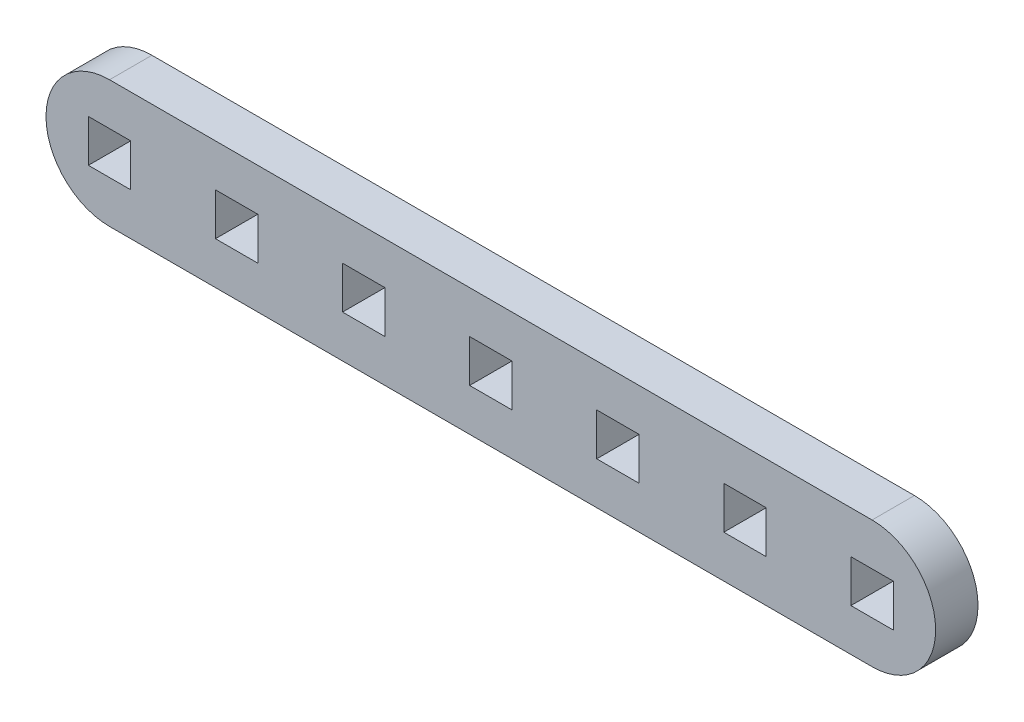
ISO-10303-21;
HEADER;
FILE_DESCRIPTION(('STEP AP214'),'2;1');
FILE_NAME('part.step','',(''),(''),'','','');
FILE_SCHEMA(('AUTOMOTIVE_DESIGN { 1 0 10303 214 1 1 1 1 }'));
ENDSEC;
DATA;
#1=APPLICATION_CONTEXT('core data for automotive mechanical design processes');
#2=APPLICATION_PROTOCOL_DEFINITION('international standard','automotive_design',2000,#1);
#3=PRODUCT_CONTEXT('',#1,'mechanical');
#4=PRODUCT('Part','Part','',(#3));
#5=PRODUCT_RELATED_PRODUCT_CATEGORY('part','',(#4));
#6=PRODUCT_DEFINITION_FORMATION('','',#4);
#7=PRODUCT_DEFINITION_CONTEXT('part definition',#1,'design');
#8=PRODUCT_DEFINITION('design','',#6,#7);
#9=PRODUCT_DEFINITION_SHAPE('','',#8);
#10=(LENGTH_UNIT() NAMED_UNIT(*) SI_UNIT(.MILLI.,.METRE.));
#11=(NAMED_UNIT(*) PLANE_ANGLE_UNIT() SI_UNIT($,.RADIAN.));
#12=(NAMED_UNIT(*) SI_UNIT($,.STERADIAN.) SOLID_ANGLE_UNIT());
#13=UNCERTAINTY_MEASURE_WITH_UNIT(LENGTH_MEASURE(1.E-05),#10,'distance_accuracy_value','');
#14=(GEOMETRIC_REPRESENTATION_CONTEXT(3) GLOBAL_UNCERTAINTY_ASSIGNED_CONTEXT((#13)) GLOBAL_UNIT_ASSIGNED_CONTEXT((#10,
#11,#12)) REPRESENTATION_CONTEXT('',''));
#15=CARTESIAN_POINT('',(0.,0.,0.));
#16=DIRECTION('',(0.,0.,1.));
#17=DIRECTION('',(1.,0.,0.));
#18=AXIS2_PLACEMENT_3D('',#15,#16,#17);
#19=CARTESIAN_POINT('',(65.8708362173,292.9911849573,3.));
#20=DIRECTION('',(0.,0.,1.));
#21=DIRECTION('',(1.,0.,0.));
#22=AXIS2_PLACEMENT_3D('',#19,#20,#21);
#23=PLANE('',#22);
#24=DIRECTION('',(0.,-1.,0.));
#25=VECTOR('',#24,1.);
#26=CARTESIAN_POINT('',(55.3708362173,294.4911849573,3.));
#27=LINE('',#26,#25);
#28=CARTESIAN_POINT('',(55.3708362173,294.4911849573,3.));
#29=VERTEX_POINT('',#28);
#30=CARTESIAN_POINT('',(55.3708362173,291.4911849573,3.));
#31=VERTEX_POINT('',#30);
#32=EDGE_CURVE('E280',#29,#31,#27,.T.);
#33=ORIENTED_EDGE('',*,*,#32,.F.);
#34=DIRECTION('',(-1.,0.,0.));
#35=VECTOR('',#34,1.);
#36=CARTESIAN_POINT('',(58.3708362173,294.4911849573,3.));
#37=LINE('',#36,#35);
#38=CARTESIAN_POINT('',(58.3708362173,294.4911849573,3.));
#39=VERTEX_POINT('',#38);
#40=EDGE_CURVE('E278',#39,#29,#37,.T.);
#41=ORIENTED_EDGE('',*,*,#40,.F.);
#42=DIRECTION('',(0.,1.,0.));
#43=VECTOR('',#42,1.);
#44=CARTESIAN_POINT('',(58.3708362173,291.4911849573,3.));
#45=LINE('',#44,#43);
#46=CARTESIAN_POINT('',(58.3708362173,291.4911849573,3.));
#47=VERTEX_POINT('',#46);
#48=EDGE_CURVE('E286',#47,#39,#45,.T.);
#49=ORIENTED_EDGE('',*,*,#48,.F.);
#50=DIRECTION('',(1.,0.,0.));
#51=VECTOR('',#50,1.);
#52=CARTESIAN_POINT('',(55.3708362173,291.4911849573,3.));
#53=LINE('',#52,#51);
#54=EDGE_CURVE('E283',#31,#47,#53,.T.);
#55=ORIENTED_EDGE('',*,*,#54,.F.);
#56=EDGE_LOOP('',(#33,#41,#49,#55));
#57=FACE_BOUND('',#56,.T.);
#58=DIRECTION('',(0.,-1.,0.));
#59=VECTOR('',#58,1.);
#60=CARTESIAN_POINT('',(37.3708362173,294.4911849573,3.));
#61=LINE('',#60,#59);
#62=CARTESIAN_POINT('',(37.3708362173,294.4911849573,3.));
#63=VERTEX_POINT('',#62);
#64=CARTESIAN_POINT('',(37.3708362173,291.4911849573,3.));
#65=VERTEX_POINT('',#64);
#66=EDGE_CURVE('E342',#63,#65,#61,.T.);
#67=ORIENTED_EDGE('',*,*,#66,.F.);
#68=DIRECTION('',(-1.,0.,0.));
#69=VECTOR('',#68,1.);
#70=CARTESIAN_POINT('',(40.3708362173,294.4911849573,3.));
#71=LINE('',#70,#69);
#72=CARTESIAN_POINT('',(40.3708362173,294.4911849573,3.));
#73=VERTEX_POINT('',#72);
#74=EDGE_CURVE('E340',#73,#63,#71,.T.);
#75=ORIENTED_EDGE('',*,*,#74,.F.);
#76=DIRECTION('',(0.,1.,0.));
#77=VECTOR('',#76,1.);
#78=CARTESIAN_POINT('',(40.3708362173,291.4911849573,3.));
#79=LINE('',#78,#77);
#80=CARTESIAN_POINT('',(40.3708362173,291.4911849573,3.));
#81=VERTEX_POINT('',#80);
#82=EDGE_CURVE('E348',#81,#73,#79,.T.);
#83=ORIENTED_EDGE('',*,*,#82,.F.);
#84=DIRECTION('',(1.,0.,0.));
#85=VECTOR('',#84,1.);
#86=CARTESIAN_POINT('',(37.3708362173,291.4911849573,3.));
#87=LINE('',#86,#85);
#88=EDGE_CURVE('E345',#65,#81,#87,.T.);
#89=ORIENTED_EDGE('',*,*,#88,.F.);
#90=EDGE_LOOP('',(#67,#75,#83,#89));
#91=FACE_BOUND('',#90,.T.);
#92=DIRECTION('',(0.,-1.,0.));
#93=VECTOR('',#92,1.);
#94=CARTESIAN_POINT('',(19.3708362173,294.4911849573,3.));
#95=LINE('',#94,#93);
#96=CARTESIAN_POINT('',(19.3708362173,294.4911849573,3.));
#97=VERTEX_POINT('',#96);
#98=CARTESIAN_POINT('',(19.3708362173,291.4911849573,3.));
#99=VERTEX_POINT('',#98);
#100=EDGE_CURVE('E404',#97,#99,#95,.T.);
#101=ORIENTED_EDGE('',*,*,#100,.F.);
#102=DIRECTION('',(-1.,0.,0.));
#103=VECTOR('',#102,1.);
#104=CARTESIAN_POINT('',(22.3708362173,294.4911849573,3.));
#105=LINE('',#104,#103);
#106=CARTESIAN_POINT('',(22.3708362173,294.4911849573,3.));
#107=VERTEX_POINT('',#106);
#108=EDGE_CURVE('E402',#107,#97,#105,.T.);
#109=ORIENTED_EDGE('',*,*,#108,.F.);
#110=DIRECTION('',(0.,1.,0.));
#111=VECTOR('',#110,1.);
#112=CARTESIAN_POINT('',(22.3708362173,291.4911849573,3.));
#113=LINE('',#112,#111);
#114=CARTESIAN_POINT('',(22.3708362173,291.4911849573,3.));
#115=VERTEX_POINT('',#114);
#116=EDGE_CURVE('E410',#115,#107,#113,.T.);
#117=ORIENTED_EDGE('',*,*,#116,.F.);
#118=DIRECTION('',(1.,0.,0.));
#119=VECTOR('',#118,1.);
#120=CARTESIAN_POINT('',(19.3708362173,291.4911849573,3.));
#121=LINE('',#120,#119);
#122=EDGE_CURVE('E407',#99,#115,#121,.T.);
#123=ORIENTED_EDGE('',*,*,#122,.F.);
#124=EDGE_LOOP('',(#101,#109,#117,#123));
#125=FACE_BOUND('',#124,.T.);
#126=CARTESIAN_POINT('',(65.8708362173,292.9911849573,3.));
#127=DIRECTION('',(0.,0.,1.));
#128=DIRECTION('',(1.,0.,0.));
#129=AXIS2_PLACEMENT_3D('',#126,#127,#128);
#130=CIRCLE('',#129,4.5);
#131=CARTESIAN_POINT('',(65.8708362173,288.4911849573,3.));
#132=VERTEX_POINT('',#131);
#133=CARTESIAN_POINT('',(65.8708362173,297.4911849573,3.));
#134=VERTEX_POINT('',#133);
#135=EDGE_CURVE('E464',#132,#134,#130,.T.);
#136=ORIENTED_EDGE('',*,*,#135,.T.);
#137=DIRECTION('',(-1.,0.,0.));
#138=VECTOR('',#137,1.);
#139=CARTESIAN_POINT('',(11.8708362173,297.4911849573,3.));
#140=LINE('',#139,#138);
#141=CARTESIAN_POINT('',(11.8708362173,297.4911849573,3.));
#142=VERTEX_POINT('',#141);
#143=EDGE_CURVE('E467',#134,#142,#140,.T.);
#144=ORIENTED_EDGE('',*,*,#143,.T.);
#145=CARTESIAN_POINT('',(11.8708362173,292.9911849573,3.));
#146=DIRECTION('',(0.,0.,1.));
#147=DIRECTION('',(1.,0.,0.));
#148=AXIS2_PLACEMENT_3D('',#145,#146,#147);
#149=CIRCLE('',#148,4.5);
#150=CARTESIAN_POINT('',(11.8708362173,288.4911849573,3.));
#151=VERTEX_POINT('',#150);
#152=EDGE_CURVE('E470',#142,#151,#149,.T.);
#153=ORIENTED_EDGE('',*,*,#152,.T.);
#154=DIRECTION('',(1.,0.,0.));
#155=VECTOR('',#154,1.);
#156=CARTESIAN_POINT('',(11.8708362173,288.4911849573,3.));
#157=LINE('',#156,#155);
#158=EDGE_CURVE('E472',#151,#132,#157,.T.);
#159=ORIENTED_EDGE('',*,*,#158,.T.);
#160=EDGE_LOOP('',(#136,#144,#153,#159));
#161=FACE_BOUND('',#160,.T.);
#162=DIRECTION('',(0.,-1.,0.));
#163=VECTOR('',#162,1.);
#164=CARTESIAN_POINT('',(10.3708362173,294.4911849573,3.));
#165=LINE('',#164,#163);
#166=CARTESIAN_POINT('',(10.3708362173,294.4911849573,3.));
#167=VERTEX_POINT('',#166);
#168=CARTESIAN_POINT('',(10.3708362173,291.4911849573,3.));
#169=VERTEX_POINT('',#168);
#170=EDGE_CURVE('E435',#167,#169,#165,.T.);
#171=ORIENTED_EDGE('',*,*,#170,.F.);
#172=DIRECTION('',(-1.,0.,0.));
#173=VECTOR('',#172,1.);
#174=CARTESIAN_POINT('',(13.3708362173,294.4911849573,3.));
#175=LINE('',#174,#173);
#176=CARTESIAN_POINT('',(13.3708362173,294.4911849573,3.));
#177=VERTEX_POINT('',#176);
#178=EDGE_CURVE('E433',#177,#167,#175,.T.);
#179=ORIENTED_EDGE('',*,*,#178,.F.);
#180=DIRECTION('',(0.,1.,0.));
#181=VECTOR('',#180,1.);
#182=CARTESIAN_POINT('',(13.3708362173,291.4911849573,3.));
#183=LINE('',#182,#181);
#184=CARTESIAN_POINT('',(13.3708362173,291.4911849573,3.));
#185=VERTEX_POINT('',#184);
#186=EDGE_CURVE('E441',#185,#177,#183,.T.);
#187=ORIENTED_EDGE('',*,*,#186,.F.);
#188=DIRECTION('',(1.,0.,0.));
#189=VECTOR('',#188,1.);
#190=CARTESIAN_POINT('',(10.3708362173,291.4911849573,3.));
#191=LINE('',#190,#189);
#192=EDGE_CURVE('E438',#169,#185,#191,.T.);
#193=ORIENTED_EDGE('',*,*,#192,.F.);
#194=EDGE_LOOP('',(#171,#179,#187,#193));
#195=FACE_BOUND('',#194,.T.);
#196=DIRECTION('',(0.,-1.,0.));
#197=VECTOR('',#196,1.);
#198=CARTESIAN_POINT('',(28.3708362173,294.4911849573,3.));
#199=LINE('',#198,#197);
#200=CARTESIAN_POINT('',(28.3708362173,294.4911849573,3.));
#201=VERTEX_POINT('',#200);
#202=CARTESIAN_POINT('',(28.3708362173,291.4911849573,3.));
#203=VERTEX_POINT('',#202);
#204=EDGE_CURVE('E373',#201,#203,#199,.T.);
#205=ORIENTED_EDGE('',*,*,#204,.F.);
#206=DIRECTION('',(-1.,0.,0.));
#207=VECTOR('',#206,1.);
#208=CARTESIAN_POINT('',(31.3708362173,294.4911849573,3.));
#209=LINE('',#208,#207);
#210=CARTESIAN_POINT('',(31.3708362173,294.4911849573,3.));
#211=VERTEX_POINT('',#210);
#212=EDGE_CURVE('E371',#211,#201,#209,.T.);
#213=ORIENTED_EDGE('',*,*,#212,.F.);
#214=DIRECTION('',(0.,1.,0.));
#215=VECTOR('',#214,1.);
#216=CARTESIAN_POINT('',(31.3708362173,291.4911849573,3.));
#217=LINE('',#216,#215);
#218=CARTESIAN_POINT('',(31.3708362173,291.4911849573,3.));
#219=VERTEX_POINT('',#218);
#220=EDGE_CURVE('E379',#219,#211,#217,.T.);
#221=ORIENTED_EDGE('',*,*,#220,.F.);
#222=DIRECTION('',(1.,0.,0.));
#223=VECTOR('',#222,1.);
#224=CARTESIAN_POINT('',(28.3708362173,291.4911849573,3.));
#225=LINE('',#224,#223);
#226=EDGE_CURVE('E376',#203,#219,#225,.T.);
#227=ORIENTED_EDGE('',*,*,#226,.F.);
#228=EDGE_LOOP('',(#205,#213,#221,#227));
#229=FACE_BOUND('',#228,.T.);
#230=DIRECTION('',(0.,-1.,0.));
#231=VECTOR('',#230,1.);
#232=CARTESIAN_POINT('',(46.3708362173,294.4911849573,3.));
#233=LINE('',#232,#231);
#234=CARTESIAN_POINT('',(46.3708362173,294.4911849573,3.));
#235=VERTEX_POINT('',#234);
#236=CARTESIAN_POINT('',(46.3708362173,291.4911849573,3.));
#237=VERTEX_POINT('',#236);
#238=EDGE_CURVE('E311',#235,#237,#233,.T.);
#239=ORIENTED_EDGE('',*,*,#238,.F.);
#240=DIRECTION('',(-1.,0.,0.));
#241=VECTOR('',#240,1.);
#242=CARTESIAN_POINT('',(49.3708362173,294.4911849573,3.));
#243=LINE('',#242,#241);
#244=CARTESIAN_POINT('',(49.3708362173,294.4911849573,3.));
#245=VERTEX_POINT('',#244);
#246=EDGE_CURVE('E309',#245,#235,#243,.T.);
#247=ORIENTED_EDGE('',*,*,#246,.F.);
#248=DIRECTION('',(0.,1.,0.));
#249=VECTOR('',#248,1.);
#250=CARTESIAN_POINT('',(49.3708362173,291.4911849573,3.));
#251=LINE('',#250,#249);
#252=CARTESIAN_POINT('',(49.3708362173,291.4911849573,3.));
#253=VERTEX_POINT('',#252);
#254=EDGE_CURVE('E317',#253,#245,#251,.T.);
#255=ORIENTED_EDGE('',*,*,#254,.F.);
#256=DIRECTION('',(1.,0.,0.));
#257=VECTOR('',#256,1.);
#258=CARTESIAN_POINT('',(46.3708362173,291.4911849573,3.));
#259=LINE('',#258,#257);
#260=EDGE_CURVE('E314',#237,#253,#259,.T.);
#261=ORIENTED_EDGE('',*,*,#260,.F.);
#262=EDGE_LOOP('',(#239,#247,#255,#261));
#263=FACE_BOUND('',#262,.T.);
#264=DIRECTION('',(0.,-1.,0.));
#265=VECTOR('',#264,1.);
#266=CARTESIAN_POINT('',(64.3708362173,294.4911849573,3.));
#267=LINE('',#266,#265);
#268=CARTESIAN_POINT('',(64.3708362173,294.4911849573,3.));
#269=VERTEX_POINT('',#268);
#270=CARTESIAN_POINT('',(64.3708362173,291.4911849573,3.));
#271=VERTEX_POINT('',#270);
#272=EDGE_CURVE('E250',#269,#271,#267,.T.);
#273=ORIENTED_EDGE('',*,*,#272,.F.);
#274=DIRECTION('',(-1.,0.,0.));
#275=VECTOR('',#274,1.);
#276=CARTESIAN_POINT('',(67.3708362173,294.4911849573,3.));
#277=LINE('',#276,#275);
#278=CARTESIAN_POINT('',(67.3708362173,294.4911849573,3.));
#279=VERTEX_POINT('',#278);
#280=EDGE_CURVE('E242',#279,#269,#277,.T.);
#281=ORIENTED_EDGE('',*,*,#280,.F.);
#282=DIRECTION('',(0.,1.,0.));
#283=VECTOR('',#282,1.);
#284=CARTESIAN_POINT('',(67.3708362173,291.4911849573,3.));
#285=LINE('',#284,#283);
#286=CARTESIAN_POINT('',(67.3708362173,291.4911849573,3.));
#287=VERTEX_POINT('',#286);
#288=EDGE_CURVE('E264',#287,#279,#285,.T.);
#289=ORIENTED_EDGE('',*,*,#288,.F.);
#290=DIRECTION('',(1.,0.,0.));
#291=VECTOR('',#290,1.);
#292=CARTESIAN_POINT('',(64.3708362173,291.4911849573,3.));
#293=LINE('',#292,#291);
#294=EDGE_CURVE('E262',#271,#287,#293,.T.);
#295=ORIENTED_EDGE('',*,*,#294,.F.);
#296=EDGE_LOOP('',(#273,#281,#289,#295));
#297=FACE_BOUND('',#296,.T.);
#298=ADVANCED_FACE('F33',(#57,#91,#125,#161,#195,#229,#263,#297),#23,.T.);
#299=CARTESIAN_POINT('',(65.8708362173,292.9911849573,0.));
#300=DIRECTION('',(0.,0.,1.));
#301=DIRECTION('',(1.,0.,0.));
#302=AXIS2_PLACEMENT_3D('',#299,#300,#301);
#303=PLANE('',#302);
#304=DIRECTION('',(-1.,0.,0.));
#305=VECTOR('',#304,1.);
#306=CARTESIAN_POINT('',(58.3708362173,294.4911849573,0.));
#307=LINE('',#306,#305);
#308=CARTESIAN_POINT('',(58.3708362173,294.4911849573,0.));
#309=VERTEX_POINT('',#308);
#310=CARTESIAN_POINT('',(55.3708362173,294.4911849573,0.));
#311=VERTEX_POINT('',#310);
#312=EDGE_CURVE('E258',#309,#311,#307,.T.);
#313=ORIENTED_EDGE('',*,*,#312,.T.);
#314=DIRECTION('',(0.,-1.,0.));
#315=VECTOR('',#314,1.);
#316=CARTESIAN_POINT('',(55.3708362173,294.4911849573,0.));
#317=LINE('',#316,#315);
#318=CARTESIAN_POINT('',(55.3708362173,291.4911849573,0.));
#319=VERTEX_POINT('',#318);
#320=EDGE_CURVE('E291',#311,#319,#317,.T.);
#321=ORIENTED_EDGE('',*,*,#320,.T.);
#322=DIRECTION('',(1.,0.,0.));
#323=VECTOR('',#322,1.);
#324=CARTESIAN_POINT('',(55.3708362173,291.4911849573,0.));
#325=LINE('',#324,#323);
#326=CARTESIAN_POINT('',(58.3708362173,291.4911849573,0.));
#327=VERTEX_POINT('',#326);
#328=EDGE_CURVE('E294',#319,#327,#325,.T.);
#329=ORIENTED_EDGE('',*,*,#328,.T.);
#330=DIRECTION('',(0.,1.,0.));
#331=VECTOR('',#330,1.);
#332=CARTESIAN_POINT('',(58.3708362173,291.4911849573,0.));
#333=LINE('',#332,#331);
#334=EDGE_CURVE('E281',#327,#309,#333,.T.);
#335=ORIENTED_EDGE('',*,*,#334,.T.);
#336=EDGE_LOOP('',(#313,#321,#329,#335));
#337=FACE_BOUND('',#336,.T.);
#338=DIRECTION('',(-1.,0.,0.));
#339=VECTOR('',#338,1.);
#340=CARTESIAN_POINT('',(40.3708362173,294.4911849573,0.));
#341=LINE('',#340,#339);
#342=CARTESIAN_POINT('',(40.3708362173,294.4911849573,0.));
#343=VERTEX_POINT('',#342);
#344=CARTESIAN_POINT('',(37.3708362173,294.4911849573,0.));
#345=VERTEX_POINT('',#344);
#346=EDGE_CURVE('E339',#343,#345,#341,.T.);
#347=ORIENTED_EDGE('',*,*,#346,.T.);
#348=DIRECTION('',(0.,-1.,0.));
#349=VECTOR('',#348,1.);
#350=CARTESIAN_POINT('',(37.3708362173,294.4911849573,0.));
#351=LINE('',#350,#349);
#352=CARTESIAN_POINT('',(37.3708362173,291.4911849573,0.));
#353=VERTEX_POINT('',#352);
#354=EDGE_CURVE('E353',#345,#353,#351,.T.);
#355=ORIENTED_EDGE('',*,*,#354,.T.);
#356=DIRECTION('',(1.,0.,0.));
#357=VECTOR('',#356,1.);
#358=CARTESIAN_POINT('',(37.3708362173,291.4911849573,0.));
#359=LINE('',#358,#357);
#360=CARTESIAN_POINT('',(40.3708362173,291.4911849573,0.));
#361=VERTEX_POINT('',#360);
#362=EDGE_CURVE('E356',#353,#361,#359,.T.);
#363=ORIENTED_EDGE('',*,*,#362,.T.);
#364=DIRECTION('',(0.,1.,0.));
#365=VECTOR('',#364,1.);
#366=CARTESIAN_POINT('',(40.3708362173,291.4911849573,0.));
#367=LINE('',#366,#365);
#368=EDGE_CURVE('E343',#361,#343,#367,.T.);
#369=ORIENTED_EDGE('',*,*,#368,.T.);
#370=EDGE_LOOP('',(#347,#355,#363,#369));
#371=FACE_BOUND('',#370,.T.);
#372=DIRECTION('',(-1.,0.,0.));
#373=VECTOR('',#372,1.);
#374=CARTESIAN_POINT('',(22.3708362173,294.4911849573,0.));
#375=LINE('',#374,#373);
#376=CARTESIAN_POINT('',(22.3708362173,294.4911849573,0.));
#377=VERTEX_POINT('',#376);
#378=CARTESIAN_POINT('',(19.3708362173,294.4911849573,0.));
#379=VERTEX_POINT('',#378);
#380=EDGE_CURVE('E401',#377,#379,#375,.T.);
#381=ORIENTED_EDGE('',*,*,#380,.T.);
#382=DIRECTION('',(0.,-1.,0.));
#383=VECTOR('',#382,1.);
#384=CARTESIAN_POINT('',(19.3708362173,294.4911849573,0.));
#385=LINE('',#384,#383);
#386=CARTESIAN_POINT('',(19.3708362173,291.4911849573,0.));
#387=VERTEX_POINT('',#386);
#388=EDGE_CURVE('E415',#379,#387,#385,.T.);
#389=ORIENTED_EDGE('',*,*,#388,.T.);
#390=DIRECTION('',(1.,0.,0.));
#391=VECTOR('',#390,1.);
#392=CARTESIAN_POINT('',(19.3708362173,291.4911849573,0.));
#393=LINE('',#392,#391);
#394=CARTESIAN_POINT('',(22.3708362173,291.4911849573,0.));
#395=VERTEX_POINT('',#394);
#396=EDGE_CURVE('E418',#387,#395,#393,.T.);
#397=ORIENTED_EDGE('',*,*,#396,.T.);
#398=DIRECTION('',(0.,1.,0.));
#399=VECTOR('',#398,1.);
#400=CARTESIAN_POINT('',(22.3708362173,291.4911849573,0.));
#401=LINE('',#400,#399);
#402=EDGE_CURVE('E405',#395,#377,#401,.T.);
#403=ORIENTED_EDGE('',*,*,#402,.T.);
#404=EDGE_LOOP('',(#381,#389,#397,#403));
#405=FACE_BOUND('',#404,.T.);
#406=CARTESIAN_POINT('',(65.8708362173,292.9911849573,0.));
#407=DIRECTION('',(0.,0.,1.));
#408=DIRECTION('',(1.,0.,0.));
#409=AXIS2_PLACEMENT_3D('',#406,#407,#408);
#410=CIRCLE('',#409,4.5);
#411=CARTESIAN_POINT('',(65.8708362173,288.4911849573,0.));
#412=VERTEX_POINT('',#411);
#413=CARTESIAN_POINT('',(65.8708362173,297.4911849573,0.));
#414=VERTEX_POINT('',#413);
#415=EDGE_CURVE('E463',#412,#414,#410,.T.);
#416=ORIENTED_EDGE('',*,*,#415,.F.);
#417=DIRECTION('',(1.,0.,0.));
#418=VECTOR('',#417,1.);
#419=CARTESIAN_POINT('',(11.8708362173,288.4911849573,0.));
#420=LINE('',#419,#418);
#421=CARTESIAN_POINT('',(11.8708362173,288.4911849573,0.));
#422=VERTEX_POINT('',#421);
#423=EDGE_CURVE('E468',#422,#412,#420,.T.);
#424=ORIENTED_EDGE('',*,*,#423,.F.);
#425=CARTESIAN_POINT('',(11.8708362173,292.9911849573,0.));
#426=DIRECTION('',(0.,0.,1.));
#427=DIRECTION('',(1.,0.,0.));
#428=AXIS2_PLACEMENT_3D('',#425,#426,#427);
#429=CIRCLE('',#428,4.5);
#430=CARTESIAN_POINT('',(11.8708362173,297.4911849573,0.));
#431=VERTEX_POINT('',#430);
#432=EDGE_CURVE('E479',#431,#422,#429,.T.);
#433=ORIENTED_EDGE('',*,*,#432,.F.);
#434=DIRECTION('',(-1.,0.,0.));
#435=VECTOR('',#434,1.);
#436=CARTESIAN_POINT('',(11.8708362173,297.4911849573,0.));
#437=LINE('',#436,#435);
#438=EDGE_CURVE('E477',#414,#431,#437,.T.);
#439=ORIENTED_EDGE('',*,*,#438,.F.);
#440=EDGE_LOOP('',(#416,#424,#433,#439));
#441=FACE_BOUND('',#440,.T.);
#442=DIRECTION('',(-1.,0.,0.));
#443=VECTOR('',#442,1.);
#444=CARTESIAN_POINT('',(13.3708362173,294.4911849573,0.));
#445=LINE('',#444,#443);
#446=CARTESIAN_POINT('',(13.3708362173,294.4911849573,0.));
#447=VERTEX_POINT('',#446);
#448=CARTESIAN_POINT('',(10.3708362173,294.4911849573,0.));
#449=VERTEX_POINT('',#448);
#450=EDGE_CURVE('E432',#447,#449,#445,.T.);
#451=ORIENTED_EDGE('',*,*,#450,.T.);
#452=DIRECTION('',(0.,-1.,0.));
#453=VECTOR('',#452,1.);
#454=CARTESIAN_POINT('',(10.3708362173,294.4911849573,0.));
#455=LINE('',#454,#453);
#456=CARTESIAN_POINT('',(10.3708362173,291.4911849573,0.));
#457=VERTEX_POINT('',#456);
#458=EDGE_CURVE('E446',#449,#457,#455,.T.);
#459=ORIENTED_EDGE('',*,*,#458,.T.);
#460=DIRECTION('',(1.,0.,0.));
#461=VECTOR('',#460,1.);
#462=CARTESIAN_POINT('',(10.3708362173,291.4911849573,0.));
#463=LINE('',#462,#461);
#464=CARTESIAN_POINT('',(13.3708362173,291.4911849573,0.));
#465=VERTEX_POINT('',#464);
#466=EDGE_CURVE('E449',#457,#465,#463,.T.);
#467=ORIENTED_EDGE('',*,*,#466,.T.);
#468=DIRECTION('',(0.,1.,0.));
#469=VECTOR('',#468,1.);
#470=CARTESIAN_POINT('',(13.3708362173,291.4911849573,0.));
#471=LINE('',#470,#469);
#472=EDGE_CURVE('E436',#465,#447,#471,.T.);
#473=ORIENTED_EDGE('',*,*,#472,.T.);
#474=EDGE_LOOP('',(#451,#459,#467,#473));
#475=FACE_BOUND('',#474,.T.);
#476=DIRECTION('',(-1.,0.,0.));
#477=VECTOR('',#476,1.);
#478=CARTESIAN_POINT('',(31.3708362173,294.4911849573,0.));
#479=LINE('',#478,#477);
#480=CARTESIAN_POINT('',(31.3708362173,294.4911849573,0.));
#481=VERTEX_POINT('',#480);
#482=CARTESIAN_POINT('',(28.3708362173,294.4911849573,0.));
#483=VERTEX_POINT('',#482);
#484=EDGE_CURVE('E370',#481,#483,#479,.T.);
#485=ORIENTED_EDGE('',*,*,#484,.T.);
#486=DIRECTION('',(0.,-1.,0.));
#487=VECTOR('',#486,1.);
#488=CARTESIAN_POINT('',(28.3708362173,294.4911849573,0.));
#489=LINE('',#488,#487);
#490=CARTESIAN_POINT('',(28.3708362173,291.4911849573,0.));
#491=VERTEX_POINT('',#490);
#492=EDGE_CURVE('E384',#483,#491,#489,.T.);
#493=ORIENTED_EDGE('',*,*,#492,.T.);
#494=DIRECTION('',(1.,0.,0.));
#495=VECTOR('',#494,1.);
#496=CARTESIAN_POINT('',(28.3708362173,291.4911849573,0.));
#497=LINE('',#496,#495);
#498=CARTESIAN_POINT('',(31.3708362173,291.4911849573,0.));
#499=VERTEX_POINT('',#498);
#500=EDGE_CURVE('E387',#491,#499,#497,.T.);
#501=ORIENTED_EDGE('',*,*,#500,.T.);
#502=DIRECTION('',(0.,1.,0.));
#503=VECTOR('',#502,1.);
#504=CARTESIAN_POINT('',(31.3708362173,291.4911849573,0.));
#505=LINE('',#504,#503);
#506=EDGE_CURVE('E374',#499,#481,#505,.T.);
#507=ORIENTED_EDGE('',*,*,#506,.T.);
#508=EDGE_LOOP('',(#485,#493,#501,#507));
#509=FACE_BOUND('',#508,.T.);
#510=DIRECTION('',(-1.,0.,0.));
#511=VECTOR('',#510,1.);
#512=CARTESIAN_POINT('',(49.3708362173,294.4911849573,0.));
#513=LINE('',#512,#511);
#514=CARTESIAN_POINT('',(49.3708362173,294.4911849573,0.));
#515=VERTEX_POINT('',#514);
#516=CARTESIAN_POINT('',(46.3708362173,294.4911849573,0.));
#517=VERTEX_POINT('',#516);
#518=EDGE_CURVE('E308',#515,#517,#513,.T.);
#519=ORIENTED_EDGE('',*,*,#518,.T.);
#520=DIRECTION('',(0.,-1.,0.));
#521=VECTOR('',#520,1.);
#522=CARTESIAN_POINT('',(46.3708362173,294.4911849573,0.));
#523=LINE('',#522,#521);
#524=CARTESIAN_POINT('',(46.3708362173,291.4911849573,0.));
#525=VERTEX_POINT('',#524);
#526=EDGE_CURVE('E322',#517,#525,#523,.T.);
#527=ORIENTED_EDGE('',*,*,#526,.T.);
#528=DIRECTION('',(1.,0.,0.));
#529=VECTOR('',#528,1.);
#530=CARTESIAN_POINT('',(46.3708362173,291.4911849573,0.));
#531=LINE('',#530,#529);
#532=CARTESIAN_POINT('',(49.3708362173,291.4911849573,0.));
#533=VERTEX_POINT('',#532);
#534=EDGE_CURVE('E325',#525,#533,#531,.T.);
#535=ORIENTED_EDGE('',*,*,#534,.T.);
#536=DIRECTION('',(0.,1.,0.));
#537=VECTOR('',#536,1.);
#538=CARTESIAN_POINT('',(49.3708362173,291.4911849573,0.));
#539=LINE('',#538,#537);
#540=EDGE_CURVE('E312',#533,#515,#539,.T.);
#541=ORIENTED_EDGE('',*,*,#540,.T.);
#542=EDGE_LOOP('',(#519,#527,#535,#541));
#543=FACE_BOUND('',#542,.T.);
#544=DIRECTION('',(-1.,0.,0.));
#545=VECTOR('',#544,1.);
#546=CARTESIAN_POINT('',(67.3708362173,294.4911849573,0.));
#547=LINE('',#546,#545);
#548=CARTESIAN_POINT('',(67.3708362173,294.4911849573,0.));
#549=VERTEX_POINT('',#548);
#550=CARTESIAN_POINT('',(64.3708362173,294.4911849573,0.));
#551=VERTEX_POINT('',#550);
#552=EDGE_CURVE('E56',#549,#551,#547,.T.);
#553=ORIENTED_EDGE('',*,*,#552,.T.);
#554=DIRECTION('',(0.,-1.,0.));
#555=VECTOR('',#554,1.);
#556=CARTESIAN_POINT('',(64.3708362173,294.4911849573,0.));
#557=LINE('',#556,#555);
#558=CARTESIAN_POINT('',(64.3708362173,291.4911849573,0.));
#559=VERTEX_POINT('',#558);
#560=EDGE_CURVE('E257',#551,#559,#557,.T.);
#561=ORIENTED_EDGE('',*,*,#560,.T.);
#562=DIRECTION('',(1.,0.,0.));
#563=VECTOR('',#562,1.);
#564=CARTESIAN_POINT('',(64.3708362173,291.4911849573,0.));
#565=LINE('',#564,#563);
#566=CARTESIAN_POINT('',(67.3708362173,291.4911849573,0.));
#567=VERTEX_POINT('',#566);
#568=EDGE_CURVE('E270',#559,#567,#565,.T.);
#569=ORIENTED_EDGE('',*,*,#568,.T.);
#570=DIRECTION('',(0.,1.,0.));
#571=VECTOR('',#570,1.);
#572=CARTESIAN_POINT('',(67.3708362173,291.4911849573,0.));
#573=LINE('',#572,#571);
#574=EDGE_CURVE('E251',#567,#549,#573,.T.);
#575=ORIENTED_EDGE('',*,*,#574,.T.);
#576=EDGE_LOOP('',(#553,#561,#569,#575));
#577=FACE_BOUND('',#576,.T.);
#578=ADVANCED_FACE('F497',(#337,#371,#405,#441,#475,#509,#543,#577),#303,.F.);
#579=CARTESIAN_POINT('',(65.8708362173,292.9911849573,3.));
#580=DIRECTION('',(0.,0.,-1.));
#581=DIRECTION('',(-1.,0.,0.));
#582=AXIS2_PLACEMENT_3D('',#579,#580,#581);
#583=CYLINDRICAL_SURFACE('',#582,4.5);
#584=ORIENTED_EDGE('',*,*,#415,.T.);
#585=DIRECTION('',(0.,0.,-1.));
#586=VECTOR('',#585,1.);
#587=CARTESIAN_POINT('',(65.8708362173,297.4911849573,3.));
#588=LINE('',#587,#586);
#589=EDGE_CURVE('E11',#134,#414,#588,.T.);
#590=ORIENTED_EDGE('',*,*,#589,.F.);
#591=ORIENTED_EDGE('',*,*,#135,.F.);
#592=DIRECTION('',(0.,0.,-1.));
#593=VECTOR('',#592,1.);
#594=CARTESIAN_POINT('',(65.8708362173,288.4911849573,3.));
#595=LINE('',#594,#593);
#596=EDGE_CURVE('E474',#132,#412,#595,.T.);
#597=ORIENTED_EDGE('',*,*,#596,.T.);
#598=EDGE_LOOP('',(#584,#590,#591,#597));
#599=FACE_BOUND('',#598,.T.);
#600=ADVANCED_FACE('F35',(#599),#583,.T.);
#601=CARTESIAN_POINT('',(11.8708362173,297.4911849573,3.));
#602=DIRECTION('',(0.,-1.,0.));
#603=DIRECTION('',(0.,0.,-1.));
#604=AXIS2_PLACEMENT_3D('',#601,#602,#603);
#605=PLANE('',#604);
#606=ORIENTED_EDGE('',*,*,#438,.T.);
#607=DIRECTION('',(0.,0.,-1.));
#608=VECTOR('',#607,1.);
#609=CARTESIAN_POINT('',(11.8708362173,297.4911849573,3.));
#610=LINE('',#609,#608);
#611=EDGE_CURVE('E41',#142,#431,#610,.T.);
#612=ORIENTED_EDGE('',*,*,#611,.F.);
#613=ORIENTED_EDGE('',*,*,#143,.F.);
#614=ORIENTED_EDGE('',*,*,#589,.T.);
#615=EDGE_LOOP('',(#606,#612,#613,#614));
#616=FACE_BOUND('',#615,.T.);
#617=ADVANCED_FACE('F508',(#616),#605,.F.);
#618=CARTESIAN_POINT('',(11.8708362173,292.9911849573,3.));
#619=DIRECTION('',(0.,0.,-1.));
#620=DIRECTION('',(-1.,0.,0.));
#621=AXIS2_PLACEMENT_3D('',#618,#619,#620);
#622=CYLINDRICAL_SURFACE('',#621,4.5);
#623=ORIENTED_EDGE('',*,*,#432,.T.);
#624=DIRECTION('',(0.,0.,-1.));
#625=VECTOR('',#624,1.);
#626=CARTESIAN_POINT('',(11.8708362173,288.4911849573,3.));
#627=LINE('',#626,#625);
#628=EDGE_CURVE('E484',#151,#422,#627,.T.);
#629=ORIENTED_EDGE('',*,*,#628,.F.);
#630=ORIENTED_EDGE('',*,*,#152,.F.);
#631=ORIENTED_EDGE('',*,*,#611,.T.);
#632=EDGE_LOOP('',(#623,#629,#630,#631));
#633=FACE_BOUND('',#632,.T.);
#634=ADVANCED_FACE('F491',(#633),#622,.T.);
#635=CARTESIAN_POINT('',(11.8708362173,288.4911849573,3.));
#636=DIRECTION('',(0.,1.,0.));
#637=DIRECTION('',(0.,0.,1.));
#638=AXIS2_PLACEMENT_3D('',#635,#636,#637);
#639=PLANE('',#638);
#640=ORIENTED_EDGE('',*,*,#423,.T.);
#641=ORIENTED_EDGE('',*,*,#596,.F.);
#642=ORIENTED_EDGE('',*,*,#158,.F.);
#643=ORIENTED_EDGE('',*,*,#628,.T.);
#644=EDGE_LOOP('',(#640,#641,#642,#643));
#645=FACE_BOUND('',#644,.T.);
#646=ADVANCED_FACE('F501',(#645),#639,.F.);
#647=CARTESIAN_POINT('',(13.3708362173,294.4911849573,3.));
#648=DIRECTION('',(0.,-1.,0.));
#649=DIRECTION('',(0.,0.,-1.));
#650=AXIS2_PLACEMENT_3D('',#647,#648,#649);
#651=PLANE('',#650);
#652=ORIENTED_EDGE('',*,*,#450,.F.);
#653=DIRECTION('',(0.,0.,-1.));
#654=VECTOR('',#653,1.);
#655=CARTESIAN_POINT('',(13.3708362173,294.4911849573,3.));
#656=LINE('',#655,#654);
#657=EDGE_CURVE('E443',#177,#447,#656,.T.);
#658=ORIENTED_EDGE('',*,*,#657,.F.);
#659=ORIENTED_EDGE('',*,*,#178,.T.);
#660=DIRECTION('',(0.,0.,-1.));
#661=VECTOR('',#660,1.);
#662=CARTESIAN_POINT('',(10.3708362173,294.4911849573,3.));
#663=LINE('',#662,#661);
#664=EDGE_CURVE('E460',#167,#449,#663,.T.);
#665=ORIENTED_EDGE('',*,*,#664,.T.);
#666=EDGE_LOOP('',(#652,#658,#659,#665));
#667=FACE_BOUND('',#666,.T.);
#668=ADVANCED_FACE('F526',(#667),#651,.T.);
#669=CARTESIAN_POINT('',(10.3708362173,294.4911849573,3.));
#670=DIRECTION('',(1.,0.,0.));
#671=DIRECTION('',(0.,0.,-1.));
#672=AXIS2_PLACEMENT_3D('',#669,#670,#671);
#673=PLANE('',#672);
#674=ORIENTED_EDGE('',*,*,#458,.F.);
#675=ORIENTED_EDGE('',*,*,#664,.F.);
#676=ORIENTED_EDGE('',*,*,#170,.T.);
#677=DIRECTION('',(0.,0.,-1.));
#678=VECTOR('',#677,1.);
#679=CARTESIAN_POINT('',(10.3708362173,291.4911849573,3.));
#680=LINE('',#679,#678);
#681=EDGE_CURVE('E458',#169,#457,#680,.T.);
#682=ORIENTED_EDGE('',*,*,#681,.T.);
#683=EDGE_LOOP('',(#674,#675,#676,#682));
#684=FACE_BOUND('',#683,.T.);
#685=ADVANCED_FACE('F533',(#684),#673,.T.);
#686=CARTESIAN_POINT('',(10.3708362173,291.4911849573,3.));
#687=DIRECTION('',(0.,1.,0.));
#688=DIRECTION('',(0.,0.,1.));
#689=AXIS2_PLACEMENT_3D('',#686,#687,#688);
#690=PLANE('',#689);
#691=ORIENTED_EDGE('',*,*,#466,.F.);
#692=ORIENTED_EDGE('',*,*,#681,.F.);
#693=ORIENTED_EDGE('',*,*,#192,.T.);
#694=DIRECTION('',(0.,0.,-1.));
#695=VECTOR('',#694,1.);
#696=CARTESIAN_POINT('',(13.3708362173,291.4911849573,3.));
#697=LINE('',#696,#695);
#698=EDGE_CURVE('E456',#185,#465,#697,.T.);
#699=ORIENTED_EDGE('',*,*,#698,.T.);
#700=EDGE_LOOP('',(#691,#692,#693,#699));
#701=FACE_BOUND('',#700,.T.);
#702=ADVANCED_FACE('F538',(#701),#690,.T.);
#703=CARTESIAN_POINT('',(13.3708362173,291.4911849573,3.));
#704=DIRECTION('',(-1.,0.,0.));
#705=DIRECTION('',(0.,0.,1.));
#706=AXIS2_PLACEMENT_3D('',#703,#704,#705);
#707=PLANE('',#706);
#708=ORIENTED_EDGE('',*,*,#472,.F.);
#709=ORIENTED_EDGE('',*,*,#698,.F.);
#710=ORIENTED_EDGE('',*,*,#186,.T.);
#711=ORIENTED_EDGE('',*,*,#657,.T.);
#712=EDGE_LOOP('',(#708,#709,#710,#711));
#713=FACE_BOUND('',#712,.T.);
#714=ADVANCED_FACE('F545',(#713),#707,.T.);
#715=CARTESIAN_POINT('',(22.3708362173,294.4911849573,3.));
#716=DIRECTION('',(0.,-1.,0.));
#717=DIRECTION('',(0.,0.,-1.));
#718=AXIS2_PLACEMENT_3D('',#715,#716,#717);
#719=PLANE('',#718);
#720=ORIENTED_EDGE('',*,*,#380,.F.);
#721=DIRECTION('',(0.,0.,-1.));
#722=VECTOR('',#721,1.);
#723=CARTESIAN_POINT('',(22.3708362173,294.4911849573,3.));
#724=LINE('',#723,#722);
#725=EDGE_CURVE('E412',#107,#377,#724,.T.);
#726=ORIENTED_EDGE('',*,*,#725,.F.);
#727=ORIENTED_EDGE('',*,*,#108,.T.);
#728=DIRECTION('',(0.,0.,-1.));
#729=VECTOR('',#728,1.);
#730=CARTESIAN_POINT('',(19.3708362173,294.4911849573,3.));
#731=LINE('',#730,#729);
#732=EDGE_CURVE('E429',#97,#379,#731,.T.);
#733=ORIENTED_EDGE('',*,*,#732,.T.);
#734=EDGE_LOOP('',(#720,#726,#727,#733));
#735=FACE_BOUND('',#734,.T.);
#736=ADVANCED_FACE('F637',(#735),#719,.T.);
#737=CARTESIAN_POINT('',(19.3708362173,294.4911849573,3.));
#738=DIRECTION('',(1.,0.,0.));
#739=DIRECTION('',(0.,0.,-1.));
#740=AXIS2_PLACEMENT_3D('',#737,#738,#739);
#741=PLANE('',#740);
#742=ORIENTED_EDGE('',*,*,#388,.F.);
#743=ORIENTED_EDGE('',*,*,#732,.F.);
#744=ORIENTED_EDGE('',*,*,#100,.T.);
#745=DIRECTION('',(0.,0.,-1.));
#746=VECTOR('',#745,1.);
#747=CARTESIAN_POINT('',(19.3708362173,291.4911849573,3.));
#748=LINE('',#747,#746);
#749=EDGE_CURVE('E427',#99,#387,#748,.T.);
#750=ORIENTED_EDGE('',*,*,#749,.T.);
#751=EDGE_LOOP('',(#742,#743,#744,#750));
#752=FACE_BOUND('',#751,.T.);
#753=ADVANCED_FACE('F633',(#752),#741,.T.);
#754=CARTESIAN_POINT('',(19.3708362173,291.4911849573,3.));
#755=DIRECTION('',(0.,1.,0.));
#756=DIRECTION('',(0.,0.,1.));
#757=AXIS2_PLACEMENT_3D('',#754,#755,#756);
#758=PLANE('',#757);
#759=ORIENTED_EDGE('',*,*,#396,.F.);
#760=ORIENTED_EDGE('',*,*,#749,.F.);
#761=ORIENTED_EDGE('',*,*,#122,.T.);
#762=DIRECTION('',(0.,0.,-1.));
#763=VECTOR('',#762,1.);
#764=CARTESIAN_POINT('',(22.3708362173,291.4911849573,3.));
#765=LINE('',#764,#763);
#766=EDGE_CURVE('E425',#115,#395,#765,.T.);
#767=ORIENTED_EDGE('',*,*,#766,.T.);
#768=EDGE_LOOP('',(#759,#760,#761,#767));
#769=FACE_BOUND('',#768,.T.);
#770=ADVANCED_FACE('F629',(#769),#758,.T.);
#771=CARTESIAN_POINT('',(22.3708362173,291.4911849573,3.));
#772=DIRECTION('',(-1.,0.,0.));
#773=DIRECTION('',(0.,0.,1.));
#774=AXIS2_PLACEMENT_3D('',#771,#772,#773);
#775=PLANE('',#774);
#776=ORIENTED_EDGE('',*,*,#402,.F.);
#777=ORIENTED_EDGE('',*,*,#766,.F.);
#778=ORIENTED_EDGE('',*,*,#116,.T.);
#779=ORIENTED_EDGE('',*,*,#725,.T.);
#780=EDGE_LOOP('',(#776,#777,#778,#779));
#781=FACE_BOUND('',#780,.T.);
#782=ADVANCED_FACE('F625',(#781),#775,.T.);
#783=CARTESIAN_POINT('',(31.3708362173,294.4911849573,3.));
#784=DIRECTION('',(0.,-1.,0.));
#785=DIRECTION('',(0.,0.,-1.));
#786=AXIS2_PLACEMENT_3D('',#783,#784,#785);
#787=PLANE('',#786);
#788=ORIENTED_EDGE('',*,*,#484,.F.);
#789=DIRECTION('',(0.,0.,-1.));
#790=VECTOR('',#789,1.);
#791=CARTESIAN_POINT('',(31.3708362173,294.4911849573,3.));
#792=LINE('',#791,#790);
#793=EDGE_CURVE('E381',#211,#481,#792,.T.);
#794=ORIENTED_EDGE('',*,*,#793,.F.);
#795=ORIENTED_EDGE('',*,*,#212,.T.);
#796=DIRECTION('',(0.,0.,-1.));
#797=VECTOR('',#796,1.);
#798=CARTESIAN_POINT('',(28.3708362173,294.4911849573,3.));
#799=LINE('',#798,#797);
#800=EDGE_CURVE('E398',#201,#483,#799,.T.);
#801=ORIENTED_EDGE('',*,*,#800,.T.);
#802=EDGE_LOOP('',(#788,#794,#795,#801));
#803=FACE_BOUND('',#802,.T.);
#804=ADVANCED_FACE('F621',(#803),#787,.T.);
#805=CARTESIAN_POINT('',(28.3708362173,294.4911849573,3.));
#806=DIRECTION('',(1.,0.,0.));
#807=DIRECTION('',(0.,0.,-1.));
#808=AXIS2_PLACEMENT_3D('',#805,#806,#807);
#809=PLANE('',#808);
#810=ORIENTED_EDGE('',*,*,#492,.F.);
#811=ORIENTED_EDGE('',*,*,#800,.F.);
#812=ORIENTED_EDGE('',*,*,#204,.T.);
#813=DIRECTION('',(0.,0.,-1.));
#814=VECTOR('',#813,1.);
#815=CARTESIAN_POINT('',(28.3708362173,291.4911849573,3.));
#816=LINE('',#815,#814);
#817=EDGE_CURVE('E396',#203,#491,#816,.T.);
#818=ORIENTED_EDGE('',*,*,#817,.T.);
#819=EDGE_LOOP('',(#810,#811,#812,#818));
#820=FACE_BOUND('',#819,.T.);
#821=ADVANCED_FACE('F617',(#820),#809,.T.);
#822=CARTESIAN_POINT('',(28.3708362173,291.4911849573,3.));
#823=DIRECTION('',(0.,1.,0.));
#824=DIRECTION('',(0.,0.,1.));
#825=AXIS2_PLACEMENT_3D('',#822,#823,#824);
#826=PLANE('',#825);
#827=ORIENTED_EDGE('',*,*,#500,.F.);
#828=ORIENTED_EDGE('',*,*,#817,.F.);
#829=ORIENTED_EDGE('',*,*,#226,.T.);
#830=DIRECTION('',(0.,0.,-1.));
#831=VECTOR('',#830,1.);
#832=CARTESIAN_POINT('',(31.3708362173,291.4911849573,3.));
#833=LINE('',#832,#831);
#834=EDGE_CURVE('E394',#219,#499,#833,.T.);
#835=ORIENTED_EDGE('',*,*,#834,.T.);
#836=EDGE_LOOP('',(#827,#828,#829,#835));
#837=FACE_BOUND('',#836,.T.);
#838=ADVANCED_FACE('F613',(#837),#826,.T.);
#839=CARTESIAN_POINT('',(31.3708362173,291.4911849573,3.));
#840=DIRECTION('',(-1.,0.,0.));
#841=DIRECTION('',(0.,0.,1.));
#842=AXIS2_PLACEMENT_3D('',#839,#840,#841);
#843=PLANE('',#842);
#844=ORIENTED_EDGE('',*,*,#506,.F.);
#845=ORIENTED_EDGE('',*,*,#834,.F.);
#846=ORIENTED_EDGE('',*,*,#220,.T.);
#847=ORIENTED_EDGE('',*,*,#793,.T.);
#848=EDGE_LOOP('',(#844,#845,#846,#847));
#849=FACE_BOUND('',#848,.T.);
#850=ADVANCED_FACE('F609',(#849),#843,.T.);
#851=CARTESIAN_POINT('',(40.3708362173,294.4911849573,3.));
#852=DIRECTION('',(0.,-1.,0.));
#853=DIRECTION('',(0.,0.,-1.));
#854=AXIS2_PLACEMENT_3D('',#851,#852,#853);
#855=PLANE('',#854);
#856=ORIENTED_EDGE('',*,*,#346,.F.);
#857=DIRECTION('',(0.,0.,-1.));
#858=VECTOR('',#857,1.);
#859=CARTESIAN_POINT('',(40.3708362173,294.4911849573,3.));
#860=LINE('',#859,#858);
#861=EDGE_CURVE('E350',#73,#343,#860,.T.);
#862=ORIENTED_EDGE('',*,*,#861,.F.);
#863=ORIENTED_EDGE('',*,*,#74,.T.);
#864=DIRECTION('',(0.,0.,-1.));
#865=VECTOR('',#864,1.);
#866=CARTESIAN_POINT('',(37.3708362173,294.4911849573,3.));
#867=LINE('',#866,#865);
#868=EDGE_CURVE('E367',#63,#345,#867,.T.);
#869=ORIENTED_EDGE('',*,*,#868,.T.);
#870=EDGE_LOOP('',(#856,#862,#863,#869));
#871=FACE_BOUND('',#870,.T.);
#872=ADVANCED_FACE('F605',(#871),#855,.T.);
#873=CARTESIAN_POINT('',(37.3708362173,294.4911849573,3.));
#874=DIRECTION('',(1.,0.,0.));
#875=DIRECTION('',(0.,0.,-1.));
#876=AXIS2_PLACEMENT_3D('',#873,#874,#875);
#877=PLANE('',#876);
#878=ORIENTED_EDGE('',*,*,#354,.F.);
#879=ORIENTED_EDGE('',*,*,#868,.F.);
#880=ORIENTED_EDGE('',*,*,#66,.T.);
#881=DIRECTION('',(0.,0.,-1.));
#882=VECTOR('',#881,1.);
#883=CARTESIAN_POINT('',(37.3708362173,291.4911849573,3.));
#884=LINE('',#883,#882);
#885=EDGE_CURVE('E365',#65,#353,#884,.T.);
#886=ORIENTED_EDGE('',*,*,#885,.T.);
#887=EDGE_LOOP('',(#878,#879,#880,#886));
#888=FACE_BOUND('',#887,.T.);
#889=ADVANCED_FACE('F601',(#888),#877,.T.);
#890=CARTESIAN_POINT('',(37.3708362173,291.4911849573,3.));
#891=DIRECTION('',(0.,1.,0.));
#892=DIRECTION('',(0.,0.,1.));
#893=AXIS2_PLACEMENT_3D('',#890,#891,#892);
#894=PLANE('',#893);
#895=ORIENTED_EDGE('',*,*,#362,.F.);
#896=ORIENTED_EDGE('',*,*,#885,.F.);
#897=ORIENTED_EDGE('',*,*,#88,.T.);
#898=DIRECTION('',(0.,0.,-1.));
#899=VECTOR('',#898,1.);
#900=CARTESIAN_POINT('',(40.3708362173,291.4911849573,3.));
#901=LINE('',#900,#899);
#902=EDGE_CURVE('E363',#81,#361,#901,.T.);
#903=ORIENTED_EDGE('',*,*,#902,.T.);
#904=EDGE_LOOP('',(#895,#896,#897,#903));
#905=FACE_BOUND('',#904,.T.);
#906=ADVANCED_FACE('F597',(#905),#894,.T.);
#907=CARTESIAN_POINT('',(40.3708362173,291.4911849573,3.));
#908=DIRECTION('',(-1.,0.,0.));
#909=DIRECTION('',(0.,0.,1.));
#910=AXIS2_PLACEMENT_3D('',#907,#908,#909);
#911=PLANE('',#910);
#912=ORIENTED_EDGE('',*,*,#368,.F.);
#913=ORIENTED_EDGE('',*,*,#902,.F.);
#914=ORIENTED_EDGE('',*,*,#82,.T.);
#915=ORIENTED_EDGE('',*,*,#861,.T.);
#916=EDGE_LOOP('',(#912,#913,#914,#915));
#917=FACE_BOUND('',#916,.T.);
#918=ADVANCED_FACE('F594',(#917),#911,.T.);
#919=CARTESIAN_POINT('',(49.3708362173,294.4911849573,3.));
#920=DIRECTION('',(0.,-1.,0.));
#921=DIRECTION('',(0.,0.,-1.));
#922=AXIS2_PLACEMENT_3D('',#919,#920,#921);
#923=PLANE('',#922);
#924=ORIENTED_EDGE('',*,*,#518,.F.);
#925=DIRECTION('',(0.,0.,-1.));
#926=VECTOR('',#925,1.);
#927=CARTESIAN_POINT('',(49.3708362173,294.4911849573,3.));
#928=LINE('',#927,#926);
#929=EDGE_CURVE('E319',#245,#515,#928,.T.);
#930=ORIENTED_EDGE('',*,*,#929,.F.);
#931=ORIENTED_EDGE('',*,*,#246,.T.);
#932=DIRECTION('',(0.,0.,-1.));
#933=VECTOR('',#932,1.);
#934=CARTESIAN_POINT('',(46.3708362173,294.4911849573,3.));
#935=LINE('',#934,#933);
#936=EDGE_CURVE('E336',#235,#517,#935,.T.);
#937=ORIENTED_EDGE('',*,*,#936,.T.);
#938=EDGE_LOOP('',(#924,#930,#931,#937));
#939=FACE_BOUND('',#938,.T.);
#940=ADVANCED_FACE('F573',(#939),#923,.T.);
#941=CARTESIAN_POINT('',(46.3708362173,294.4911849573,3.));
#942=DIRECTION('',(1.,0.,0.));
#943=DIRECTION('',(0.,0.,-1.));
#944=AXIS2_PLACEMENT_3D('',#941,#942,#943);
#945=PLANE('',#944);
#946=ORIENTED_EDGE('',*,*,#526,.F.);
#947=ORIENTED_EDGE('',*,*,#936,.F.);
#948=ORIENTED_EDGE('',*,*,#238,.T.);
#949=DIRECTION('',(0.,0.,-1.));
#950=VECTOR('',#949,1.);
#951=CARTESIAN_POINT('',(46.3708362173,291.4911849573,3.));
#952=LINE('',#951,#950);
#953=EDGE_CURVE('E334',#237,#525,#952,.T.);
#954=ORIENTED_EDGE('',*,*,#953,.T.);
#955=EDGE_LOOP('',(#946,#947,#948,#954));
#956=FACE_BOUND('',#955,.T.);
#957=ADVANCED_FACE('F565',(#956),#945,.T.);
#958=CARTESIAN_POINT('',(46.3708362173,291.4911849573,3.));
#959=DIRECTION('',(0.,1.,0.));
#960=DIRECTION('',(0.,0.,1.));
#961=AXIS2_PLACEMENT_3D('',#958,#959,#960);
#962=PLANE('',#961);
#963=ORIENTED_EDGE('',*,*,#534,.F.);
#964=ORIENTED_EDGE('',*,*,#953,.F.);
#965=ORIENTED_EDGE('',*,*,#260,.T.);
#966=DIRECTION('',(0.,0.,-1.));
#967=VECTOR('',#966,1.);
#968=CARTESIAN_POINT('',(49.3708362173,291.4911849573,3.));
#969=LINE('',#968,#967);
#970=EDGE_CURVE('E332',#253,#533,#969,.T.);
#971=ORIENTED_EDGE('',*,*,#970,.T.);
#972=EDGE_LOOP('',(#963,#964,#965,#971));
#973=FACE_BOUND('',#972,.T.);
#974=ADVANCED_FACE('F568',(#973),#962,.T.);
#975=CARTESIAN_POINT('',(49.3708362173,291.4911849573,3.));
#976=DIRECTION('',(-1.,0.,0.));
#977=DIRECTION('',(0.,0.,1.));
#978=AXIS2_PLACEMENT_3D('',#975,#976,#977);
#979=PLANE('',#978);
#980=ORIENTED_EDGE('',*,*,#540,.F.);
#981=ORIENTED_EDGE('',*,*,#970,.F.);
#982=ORIENTED_EDGE('',*,*,#254,.T.);
#983=ORIENTED_EDGE('',*,*,#929,.T.);
#984=EDGE_LOOP('',(#980,#981,#982,#983));
#985=FACE_BOUND('',#984,.T.);
#986=ADVANCED_FACE('F576',(#985),#979,.T.);
#987=CARTESIAN_POINT('',(58.3708362173,294.4911849573,3.));
#988=DIRECTION('',(0.,-1.,0.));
#989=DIRECTION('',(0.,0.,-1.));
#990=AXIS2_PLACEMENT_3D('',#987,#988,#989);
#991=PLANE('',#990);
#992=ORIENTED_EDGE('',*,*,#312,.F.);
#993=DIRECTION('',(0.,0.,-1.));
#994=VECTOR('',#993,1.);
#995=CARTESIAN_POINT('',(58.3708362173,294.4911849573,3.));
#996=LINE('',#995,#994);
#997=EDGE_CURVE('E288',#39,#309,#996,.T.);
#998=ORIENTED_EDGE('',*,*,#997,.F.);
#999=ORIENTED_EDGE('',*,*,#40,.T.);
#1000=DIRECTION('',(0.,0.,-1.));
#1001=VECTOR('',#1000,1.);
#1002=CARTESIAN_POINT('',(55.3708362173,294.4911849573,3.));
#1003=LINE('',#1002,#1001);
#1004=EDGE_CURVE('E305',#29,#311,#1003,.T.);
#1005=ORIENTED_EDGE('',*,*,#1004,.T.);
#1006=EDGE_LOOP('',(#992,#998,#999,#1005));
#1007=FACE_BOUND('',#1006,.T.);
#1008=ADVANCED_FACE('F578',(#1007),#991,.T.);
#1009=CARTESIAN_POINT('',(55.3708362173,294.4911849573,3.));
#1010=DIRECTION('',(1.,0.,0.));
#1011=DIRECTION('',(0.,0.,-1.));
#1012=AXIS2_PLACEMENT_3D('',#1009,#1010,#1011);
#1013=PLANE('',#1012);
#1014=ORIENTED_EDGE('',*,*,#320,.F.);
#1015=ORIENTED_EDGE('',*,*,#1004,.F.);
#1016=ORIENTED_EDGE('',*,*,#32,.T.);
#1017=DIRECTION('',(0.,0.,-1.));
#1018=VECTOR('',#1017,1.);
#1019=CARTESIAN_POINT('',(55.3708362173,291.4911849573,3.));
#1020=LINE('',#1019,#1018);
#1021=EDGE_CURVE('E303',#31,#319,#1020,.T.);
#1022=ORIENTED_EDGE('',*,*,#1021,.T.);
#1023=EDGE_LOOP('',(#1014,#1015,#1016,#1022));
#1024=FACE_BOUND('',#1023,.T.);
#1025=ADVANCED_FACE('F584',(#1024),#1013,.T.);
#1026=CARTESIAN_POINT('',(55.3708362173,291.4911849573,3.));
#1027=DIRECTION('',(0.,1.,0.));
#1028=DIRECTION('',(0.,0.,1.));
#1029=AXIS2_PLACEMENT_3D('',#1026,#1027,#1028);
#1030=PLANE('',#1029);
#1031=ORIENTED_EDGE('',*,*,#328,.F.);
#1032=ORIENTED_EDGE('',*,*,#1021,.F.);
#1033=ORIENTED_EDGE('',*,*,#54,.T.);
#1034=DIRECTION('',(0.,0.,-1.));
#1035=VECTOR('',#1034,1.);
#1036=CARTESIAN_POINT('',(58.3708362173,291.4911849573,3.));
#1037=LINE('',#1036,#1035);
#1038=EDGE_CURVE('E301',#47,#327,#1037,.T.);
#1039=ORIENTED_EDGE('',*,*,#1038,.T.);
#1040=EDGE_LOOP('',(#1031,#1032,#1033,#1039));
#1041=FACE_BOUND('',#1040,.T.);
#1042=ADVANCED_FACE('F732',(#1041),#1030,.T.);
#1043=CARTESIAN_POINT('',(58.3708362173,291.4911849573,3.));
#1044=DIRECTION('',(-1.,0.,0.));
#1045=DIRECTION('',(0.,0.,1.));
#1046=AXIS2_PLACEMENT_3D('',#1043,#1044,#1045);
#1047=PLANE('',#1046);
#1048=ORIENTED_EDGE('',*,*,#334,.F.);
#1049=ORIENTED_EDGE('',*,*,#1038,.F.);
#1050=ORIENTED_EDGE('',*,*,#48,.T.);
#1051=ORIENTED_EDGE('',*,*,#997,.T.);
#1052=EDGE_LOOP('',(#1048,#1049,#1050,#1051));
#1053=FACE_BOUND('',#1052,.T.);
#1054=ADVANCED_FACE('F741',(#1053),#1047,.T.);
#1055=CARTESIAN_POINT('',(67.3708362173,294.4911849573,3.));
#1056=DIRECTION('',(0.,-1.,0.));
#1057=DIRECTION('',(0.,0.,-1.));
#1058=AXIS2_PLACEMENT_3D('',#1055,#1056,#1057);
#1059=PLANE('',#1058);
#1060=ORIENTED_EDGE('',*,*,#552,.F.);
#1061=DIRECTION('',(0.,0.,-1.));
#1062=VECTOR('',#1061,1.);
#1063=CARTESIAN_POINT('',(67.3708362173,294.4911849573,3.));
#1064=LINE('',#1063,#1062);
#1065=EDGE_CURVE('E246',#279,#549,#1064,.T.);
#1066=ORIENTED_EDGE('',*,*,#1065,.F.);
#1067=ORIENTED_EDGE('',*,*,#280,.T.);
#1068=DIRECTION('',(0.,0.,-1.));
#1069=VECTOR('',#1068,1.);
#1070=CARTESIAN_POINT('',(64.3708362173,294.4911849573,3.));
#1071=LINE('',#1070,#1069);
#1072=EDGE_CURVE('E245',#269,#551,#1071,.T.);
#1073=ORIENTED_EDGE('',*,*,#1072,.T.);
#1074=EDGE_LOOP('',(#1060,#1066,#1067,#1073));
#1075=FACE_BOUND('',#1074,.T.);
#1076=ADVANCED_FACE('F244',(#1075),#1059,.T.);
#1077=CARTESIAN_POINT('',(64.3708362173,294.4911849573,3.));
#1078=DIRECTION('',(1.,0.,0.));
#1079=DIRECTION('',(0.,0.,-1.));
#1080=AXIS2_PLACEMENT_3D('',#1077,#1078,#1079);
#1081=PLANE('',#1080);
#1082=ORIENTED_EDGE('',*,*,#560,.F.);
#1083=ORIENTED_EDGE('',*,*,#1072,.F.);
#1084=ORIENTED_EDGE('',*,*,#272,.T.);
#1085=DIRECTION('',(0.,0.,-1.));
#1086=VECTOR('',#1085,1.);
#1087=CARTESIAN_POINT('',(64.3708362173,291.4911849573,3.));
#1088=LINE('',#1087,#1086);
#1089=EDGE_CURVE('E259',#271,#559,#1088,.T.);
#1090=ORIENTED_EDGE('',*,*,#1089,.T.);
#1091=EDGE_LOOP('',(#1082,#1083,#1084,#1090));
#1092=FACE_BOUND('',#1091,.T.);
#1093=ADVANCED_FACE('F254',(#1092),#1081,.T.);
#1094=CARTESIAN_POINT('',(64.3708362173,291.4911849573,3.));
#1095=DIRECTION('',(0.,1.,0.));
#1096=DIRECTION('',(0.,0.,1.));
#1097=AXIS2_PLACEMENT_3D('',#1094,#1095,#1096);
#1098=PLANE('',#1097);
#1099=ORIENTED_EDGE('',*,*,#568,.F.);
#1100=ORIENTED_EDGE('',*,*,#1089,.F.);
#1101=ORIENTED_EDGE('',*,*,#294,.T.);
#1102=DIRECTION('',(0.,0.,-1.));
#1103=VECTOR('',#1102,1.);
#1104=CARTESIAN_POINT('',(67.3708362173,291.4911849573,3.));
#1105=LINE('',#1104,#1103);
#1106=EDGE_CURVE('E48',#287,#567,#1105,.T.);
#1107=ORIENTED_EDGE('',*,*,#1106,.T.);
#1108=EDGE_LOOP('',(#1099,#1100,#1101,#1107));
#1109=FACE_BOUND('',#1108,.T.);
#1110=ADVANCED_FACE('F768',(#1109),#1098,.T.);
#1111=CARTESIAN_POINT('',(67.3708362173,291.4911849573,3.));
#1112=DIRECTION('',(-1.,0.,0.));
#1113=DIRECTION('',(0.,0.,1.));
#1114=AXIS2_PLACEMENT_3D('',#1111,#1112,#1113);
#1115=PLANE('',#1114);
#1116=ORIENTED_EDGE('',*,*,#574,.F.);
#1117=ORIENTED_EDGE('',*,*,#1106,.F.);
#1118=ORIENTED_EDGE('',*,*,#288,.T.);
#1119=ORIENTED_EDGE('',*,*,#1065,.T.);
#1120=EDGE_LOOP('',(#1116,#1117,#1118,#1119));
#1121=FACE_BOUND('',#1120,.T.);
#1122=ADVANCED_FACE('F777',(#1121),#1115,.T.);
#1123=CLOSED_SHELL('',(#298,#578,#600,#617,#634,#646,#668,#685,#702,#714,#736,#753,#770,#782,
#804,#821,#838,#850,#872,#889,#906,#918,#940,#957,#974,#986,#1008,#1025,#1042,#1054,#1076,#1093,
#1110,#1122));
#1124=MANIFOLD_SOLID_BREP('B2',#1123);
#1125=ADVANCED_BREP_SHAPE_REPRESENTATION('',(#18,#1124),#14);
#1126=SHAPE_DEFINITION_REPRESENTATION(#9,#1125);
ENDSEC;
END-ISO-10303-21;
